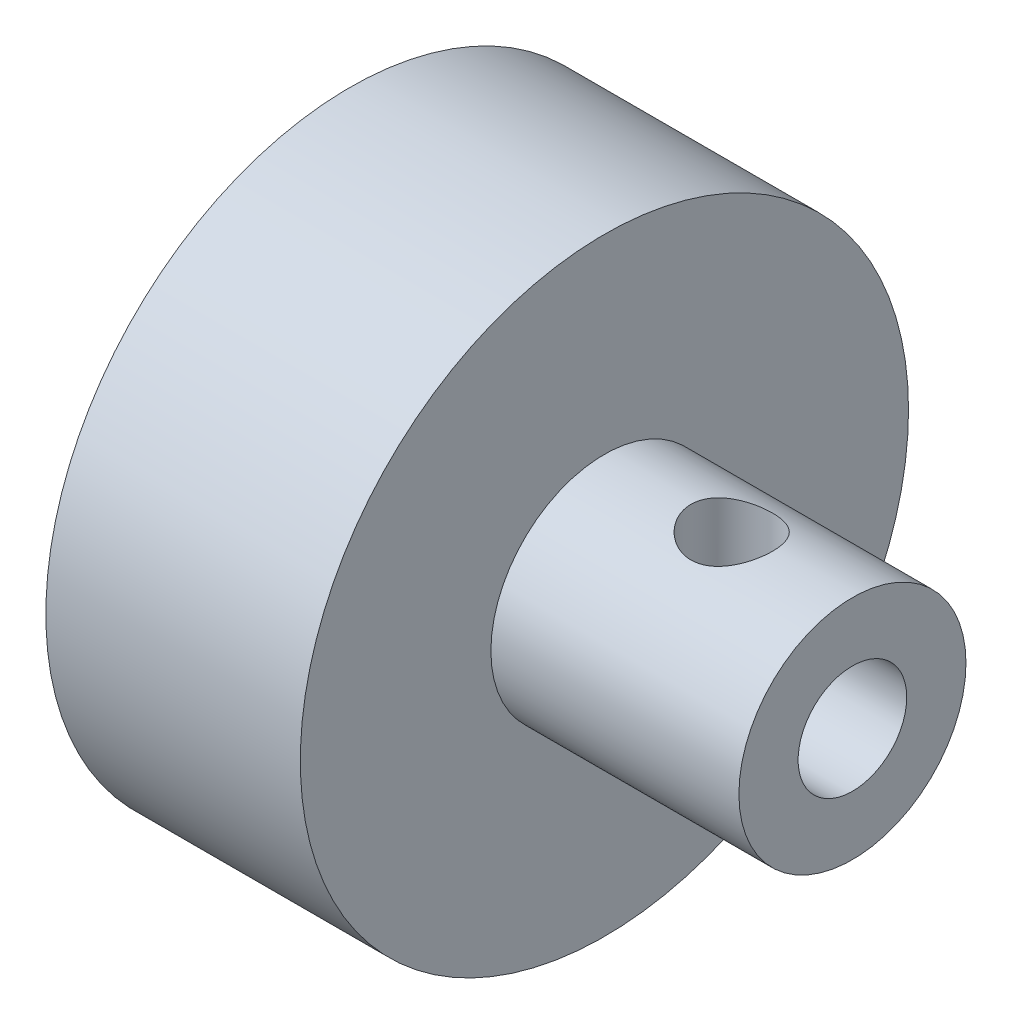
ISO-10303-21;
HEADER;
FILE_DESCRIPTION(('STEP AP214'),'2;1');
FILE_NAME('part.step','',(''),(''),'','','');
FILE_SCHEMA(('AUTOMOTIVE_DESIGN { 1 0 10303 214 1 1 1 1 }'));
ENDSEC;
DATA;
#1=APPLICATION_CONTEXT('core data for automotive mechanical design processes');
#2=APPLICATION_PROTOCOL_DEFINITION('international standard','automotive_design',2000,#1);
#3=PRODUCT_CONTEXT('',#1,'mechanical');
#4=PRODUCT('Part','Part','',(#3));
#5=PRODUCT_RELATED_PRODUCT_CATEGORY('part','',(#4));
#6=PRODUCT_DEFINITION_FORMATION('','',#4);
#7=PRODUCT_DEFINITION_CONTEXT('part definition',#1,'design');
#8=PRODUCT_DEFINITION('design','',#6,#7);
#9=PRODUCT_DEFINITION_SHAPE('','',#8);
#10=(LENGTH_UNIT() NAMED_UNIT(*) SI_UNIT(.MILLI.,.METRE.));
#11=(NAMED_UNIT(*) PLANE_ANGLE_UNIT() SI_UNIT($,.RADIAN.));
#12=(NAMED_UNIT(*) SI_UNIT($,.STERADIAN.) SOLID_ANGLE_UNIT());
#13=UNCERTAINTY_MEASURE_WITH_UNIT(LENGTH_MEASURE(1.E-05),#10,'distance_accuracy_value','');
#14=(GEOMETRIC_REPRESENTATION_CONTEXT(3) GLOBAL_UNCERTAINTY_ASSIGNED_CONTEXT((#13)) GLOBAL_UNIT_ASSIGNED_CONTEXT((#10,
#11,#12)) REPRESENTATION_CONTEXT('',''));
#15=CARTESIAN_POINT('',(0.,0.,0.));
#16=DIRECTION('',(0.,0.,1.));
#17=DIRECTION('',(1.,0.,0.));
#18=AXIS2_PLACEMENT_3D('',#15,#16,#17);
#19=CARTESIAN_POINT('',(-14.6892880689265,0.,0.));
#20=DIRECTION('',(1.,0.,0.));
#21=DIRECTION('',(0.,0.,-1.));
#22=AXIS2_PLACEMENT_3D('',#19,#20,#21);
#23=PLANE('',#22);
#24=CARTESIAN_POINT('',(-14.6892880689265,0.,0.));
#25=DIRECTION('',(1.,0.,0.));
#26=DIRECTION('',(0.,0.,-1.));
#27=AXIS2_PLACEMENT_3D('',#24,#25,#26);
#28=CIRCLE('',#27,8.89);
#29=CARTESIAN_POINT('',(-14.6892880689265,0.,-8.89));
#30=VERTEX_POINT('',#29);
#31=EDGE_CURVE('E122',#30,#30,#28,.T.);
#32=ORIENTED_EDGE('',*,*,#31,.F.);
#33=EDGE_LOOP('',(#32));
#34=FACE_BOUND('',#33,.T.);
#35=CARTESIAN_POINT('',(-14.6892880689265,0.,0.));
#36=DIRECTION('',(1.,0.,0.));
#37=DIRECTION('',(0.,0.,-1.));
#38=AXIS2_PLACEMENT_3D('',#35,#36,#37);
#39=CIRCLE('',#38,1.5875);
#40=CARTESIAN_POINT('',(-14.6892880689265,0.,-1.5875));
#41=VERTEX_POINT('',#40);
#42=EDGE_CURVE('E10',#41,#41,#39,.T.);
#43=ORIENTED_EDGE('',*,*,#42,.T.);
#44=EDGE_LOOP('',(#43));
#45=FACE_BOUND('',#44,.T.);
#46=ADVANCED_FACE('F45',(#34,#45),#23,.F.);
#47=CARTESIAN_POINT('',(0.,0.,0.));
#48=DIRECTION('',(1.,0.,0.));
#49=DIRECTION('',(0.,0.,-1.));
#50=AXIS2_PLACEMENT_3D('',#47,#48,#49);
#51=CYLINDRICAL_SURFACE('',#50,1.5875);
#52=CARTESIAN_POINT('',(-3.52955632665525,-1.05003255157876,1.190625));
#53=CARTESIAN_POINT('',(-3.47399587181116,-1.050045445975,1.19061880120499));
#54=CARTESIAN_POINT('',(-3.41839494567017,-1.05454741000987,1.18668886577821));
#55=CARTESIAN_POINT('',(-3.30942575328898,-1.07148823701036,1.17140301985762));
#56=CARTESIAN_POINT('',(-3.25606464842102,-1.08395075602632,1.16002497361435));
#57=CARTESIAN_POINT('',(-3.15365232330667,-1.11422757784016,1.13096547199778));
#58=CARTESIAN_POINT('',(-3.10455179760005,-1.13196567044321,1.11337314984434));
#59=CARTESIAN_POINT('',(-3.01016962218938,-1.17067373681068,1.0725995764387));
#60=CARTESIAN_POINT('',(-2.96488751182031,-1.19164331985289,1.04941900067592));
#61=CARTESIAN_POINT('',(-2.86906679457896,-1.2396574216291,0.992504284125244));
#62=CARTESIAN_POINT('',(-2.81941365386299,-1.26705442557768,0.957576618231006));
#63=CARTESIAN_POINT('',(-2.72586423782545,-1.321761740015,0.880535424277007));
#64=CARTESIAN_POINT('',(-2.68197661082916,-1.34907186163527,0.83841131436972));
#65=CARTESIAN_POINT('',(-2.59224970284748,-1.40702174808774,0.737878090100433));
#66=CARTESIAN_POINT('',(-2.54784159057137,-1.43720281226121,0.677900035756593));
#67=CARTESIAN_POINT('',(-2.47019994883075,-1.49131980240358,0.548631836139916));
#68=CARTESIAN_POINT('',(-2.43694016553939,-1.51527037067959,0.479364114482458));
#69=CARTESIAN_POINT('',(-2.39194772596979,-1.54808443073509,0.355496037787019));
#70=CARTESIAN_POINT('',(-2.37674788172235,-1.55931958043549,0.302772801943451));
#71=CARTESIAN_POINT('',(-2.35370292208284,-1.57643223525434,0.194907383645006));
#72=CARTESIAN_POINT('',(-2.34585141687053,-1.58231439499439,0.139767346508667));
#73=CARTESIAN_POINT('',(-2.3379615754019,-1.58822529365106,0.0284679172687354));
#74=CARTESIAN_POINT('',(-2.33794354099396,-1.58823882295637,-0.0276937463004187));
#75=CARTESIAN_POINT('',(-2.34577181397461,-1.58237401411808,-0.139157199360015));
#76=CARTESIAN_POINT('',(-2.35361994258859,-1.57649431153499,-0.194458786708892));
#77=CARTESIAN_POINT('',(-2.37630191056096,-1.55965031243376,-0.300743297572916));
#78=CARTESIAN_POINT('',(-2.390887285725,-1.54886705851508,-0.351809262912558));
#79=CARTESIAN_POINT('',(-2.4262403676374,-1.52306558684007,-0.450596385005576));
#80=CARTESIAN_POINT('',(-2.44700942243758,-1.50804644569141,-0.498316809620447));
#81=CARTESIAN_POINT('',(-2.49651420867685,-1.472890802502,-0.594690931730129));
#82=CARTESIAN_POINT('',(-2.52586905334639,-1.45237629107677,-0.642886211616418));
#83=CARTESIAN_POINT('',(-2.59033870418185,-1.40859432596468,-0.733875255122699));
#84=CARTESIAN_POINT('',(-2.62545841877955,-1.38532453106985,-0.776664360293093));
#85=CARTESIAN_POINT('',(-2.70820235978188,-1.33265676661185,-0.864458871498921));
#86=CARTESIAN_POINT('',(-2.75692738711371,-1.30295376843929,-0.908244413225473));
#87=CARTESIAN_POINT('',(-2.86108752740517,-1.24401229387742,-0.987431949727556));
#88=CARTESIAN_POINT('',(-2.91652581815327,-1.21477404494797,-1.0228299505536));
#89=CARTESIAN_POINT('',(-3.02233568616272,-1.16537919386833,-1.07849357589208));
#90=CARTESIAN_POINT('',(-3.07155229386264,-1.14456844833299,-1.10036663076556));
#91=CARTESIAN_POINT('',(-3.17400814378189,-1.10757288373056,-1.13759771455097));
#92=CARTESIAN_POINT('',(-3.22723796990948,-1.09137763785656,-1.15297046685305));
#93=CARTESIAN_POINT('',(-3.32610783845392,-1.06870540179809,-1.17397518372094));
#94=CARTESIAN_POINT('',(-3.37116119808551,-1.06093847023265,-1.18093386412912));
#95=CARTESIAN_POINT('',(-3.46236972793073,-1.05120748322927,-1.18960709991958));
#96=CARTESIAN_POINT('',(-3.50852341207812,-1.04923600365031,-1.19132836468154));
#97=CARTESIAN_POINT('',(-3.60058027634364,-1.05142402102457,-1.18939683154219));
#98=CARTESIAN_POINT('',(-3.64648335801668,-1.05558577464436,-1.1857420555772));
#99=CARTESIAN_POINT('',(-3.73678552265678,-1.06934967402693,-1.17334131022126));
#100=CARTESIAN_POINT('',(-3.78118190127656,-1.0789611050858,-1.16458665082263));
#101=CARTESIAN_POINT('',(-3.88383714982548,-1.10670783140942,-1.13834830402645));
#102=CARTESIAN_POINT('',(-3.94106486507531,-1.12668703809744,-1.11882388129336));
#103=CARTESIAN_POINT('',(-4.05050053466959,-1.1710817723223,-1.07226796784258));
#104=CARTESIAN_POINT('',(-4.10269900600796,-1.19550543916301,-1.04522265503785));
#105=CARTESIAN_POINT('',(-4.20372710179345,-1.24704699135672,-0.983216332051275));
#106=CARTESIAN_POINT('',(-4.25237117215349,-1.27422976552798,-0.948008248603961));
#107=CARTESIAN_POINT('',(-4.34394549064199,-1.32832083103686,-0.870605343134578));
#108=CARTESIAN_POINT('',(-4.38687294449647,-1.3552289822489,-0.828407126793555));
#109=CARTESIAN_POINT('',(-4.47513243876106,-1.41255926707429,-0.727261145352264));
#110=CARTESIAN_POINT('',(-4.51894604749847,-1.44246738243752,-0.666667665064069));
#111=CARTESIAN_POINT('',(-4.59526153383188,-1.49584651911049,-0.536219092541945));
#112=CARTESIAN_POINT('',(-4.62778789366665,-1.519331448665,-0.46638450504254));
#113=CARTESIAN_POINT('',(-4.6713164823662,-1.55114153831888,-0.341912306313174));
#114=CARTESIAN_POINT('',(-4.68585703131764,-1.56190535686026,-0.289123483003683));
#115=CARTESIAN_POINT('',(-4.70758355872435,-1.57805648311366,-0.181264294065456));
#116=CARTESIAN_POINT('',(-4.71477611263438,-1.58344859766149,-0.126196014246044));
#117=CARTESIAN_POINT('',(-4.72138496195483,-1.58840143581668,-0.0151984122151932));
#118=CARTESIAN_POINT('',(-4.72078300292542,-1.58794847048757,0.040732624740999));
#119=CARTESIAN_POINT('',(-4.7117985398099,-1.58121987574774,0.151613402505125));
#120=CARTESIAN_POINT('',(-4.70341396297494,-1.57494269517078,0.206562877919334));
#121=CARTESIAN_POINT('',(-4.67971998694751,-1.55736449484373,0.312358036108632));
#122=CARTESIAN_POINT('',(-4.66461868273127,-1.54621460816847,0.363276543980955));
#123=CARTESIAN_POINT('',(-4.62827454957022,-1.51973534456514,0.461693691083551));
#124=CARTESIAN_POINT('',(-4.60703040691447,-1.50440507365769,0.50919159606487));
#125=CARTESIAN_POINT('',(-4.55644821368846,-1.46857753504696,0.605272235896156));
#126=CARTESIAN_POINT('',(-4.52646589988858,-1.44769167461642,0.653368356641274));
#127=CARTESIAN_POINT('',(-4.46073108946535,-1.403234954476,0.744073006806094));
#128=CARTESIAN_POINT('',(-4.42497328955946,-1.37966163294053,0.786676427329301));
#129=CARTESIAN_POINT('',(-4.34076456694763,-1.32640667727172,0.874017021494155));
#130=CARTESIAN_POINT('',(-4.29120199709983,-1.29643919738103,0.917509051614588));
#131=CARTESIAN_POINT('',(-4.18529854458473,-1.2371870295527,0.995959824095465));
#132=CARTESIAN_POINT('',(-4.12895518973873,-1.20790259531751,1.03091544004403));
#133=CARTESIAN_POINT('',(-4.0225677464992,-1.15926871150369,1.0850242722053));
#134=CARTESIAN_POINT('',(-3.97379043413193,-1.13913939849811,1.10595986530786));
#135=CARTESIAN_POINT('',(-3.87239051441715,-1.10357098191916,1.14145534685201));
#136=CARTESIAN_POINT('',(-3.81977855895137,-1.08811945745383,1.15603216594685));
#137=CARTESIAN_POINT('',(-3.72736817735019,-1.06785111060464,1.17472664594127));
#138=CARTESIAN_POINT('',(-3.68833246381845,-1.06124478398383,1.18065747665075));
#139=CARTESIAN_POINT('',(-3.60938984980979,-1.05233228217761,1.18860759763756));
#140=CARTESIAN_POINT('',(-3.56948353840617,-1.05002328532471,1.19062945461798));
#141=CARTESIAN_POINT('',(-3.52955632665525,-1.05003255157876,1.190625));
#142=B_SPLINE_CURVE_WITH_KNOTS('',3,(#52,#53,#54,#55,#56,#57,#58,#59,#60,#61,#62,#63,#64,#65,
#66,#67,#68,#69,#70,#71,#72,#73,#74,#75,#76,#77,#78,#79,#80,#81,#82,#83,#84,#85,#86,#87,#88,#89,
#90,#91,#92,#93,#94,#95,#96,#97,#98,#99,#100,#101,#102,#103,#104,#105,#106,#107,#108,#109,#110,
#111,#112,#113,#114,#115,#116,#117,#118,#119,#120,#121,#122,#123,#124,#125,#126,#127,#128,#129,
#130,#131,#132,#133,#134,#135,#136,#137,#138,#139,#140,#141),.UNSPECIFIED.,.T.,.F.,(4,2,2,2,2,2,
2,2,2,2,2,2,2,2,2,2,2,2,2,2,2,2,2,2,2,2,2,2,2,2,2,2,2,2,2,2,2,2,2,2,2,2,2,2,4),(0.,
0.166474597743314,0.333446217300251,0.498114149835984,0.662762187833673,0.861895093986152,
1.0613233713153,1.30147098182183,1.54104901534439,1.70837006939059,1.87554549222377,
2.04315417765196,2.21080167790273,2.37270731241696,2.53464826848756,2.71412370017785,
2.89375274442082,3.10871804281232,3.32378549783047,3.49646406272525,3.66874938249073,
3.80688854402059,3.9448506680219,4.08286356658931,4.22111232464965,4.41110709885653,
4.60145338469826,4.79856172215235,4.99576605498253,5.23599171487223,5.47569301565586,
5.64239486354326,5.80894740496725,5.97589007623953,6.14287722220568,6.30501670074205,
6.46719088019845,6.64773604163628,6.82844793934811,7.0449089208391,7.26144906140521,
7.43123259464913,7.6005612670708,7.72027294583552,7.83990599300725),.UNSPECIFIED.);
#143=CARTESIAN_POINT('',(-3.52955632665525,-1.05003255157876,1.190625));
#144=VERTEX_POINT('',#143);
#145=EDGE_CURVE('E95',#144,#144,#142,.T.);
#146=ORIENTED_EDGE('',*,*,#145,.F.);
#147=EDGE_LOOP('',(#146));
#148=FACE_BOUND('',#147,.T.);
#149=CARTESIAN_POINT('',(-3.52955632665525,1.05003255157876,1.190625));
#150=CARTESIAN_POINT('',(-3.58511678149935,1.050045445975,1.19061880120499));
#151=CARTESIAN_POINT('',(-3.64071770764034,1.05454741000987,1.18668886577821));
#152=CARTESIAN_POINT('',(-3.74968690002153,1.07148823701036,1.17140301985762));
#153=CARTESIAN_POINT('',(-3.80304800488949,1.08395075602632,1.16002497361435));
#154=CARTESIAN_POINT('',(-3.90546033000384,1.11422757784016,1.13096547199778));
#155=CARTESIAN_POINT('',(-3.95456085571046,1.13196567044321,1.11337314984434));
#156=CARTESIAN_POINT('',(-4.04894303112113,1.17067373681068,1.0725995764387));
#157=CARTESIAN_POINT('',(-4.0942251414902,1.19164331985289,1.04941900067592));
#158=CARTESIAN_POINT('',(-4.19004585873155,1.2396574216291,0.992504284125244));
#159=CARTESIAN_POINT('',(-4.23969899944752,1.26705442557768,0.957576618231007));
#160=CARTESIAN_POINT('',(-4.33324841548505,1.321761740015,0.880535424277007));
#161=CARTESIAN_POINT('',(-4.37713604248134,1.34907186163527,0.83841131436972));
#162=CARTESIAN_POINT('',(-4.46686295046303,1.40702174808774,0.737878090100434));
#163=CARTESIAN_POINT('',(-4.51127106273914,1.43720281226121,0.677900035756593));
#164=CARTESIAN_POINT('',(-4.58891270447975,1.49131980240358,0.548631836139916));
#165=CARTESIAN_POINT('',(-4.62217248777112,1.51527037067959,0.479364114482458));
#166=CARTESIAN_POINT('',(-4.66716492734071,1.54808443073509,0.355496037787019));
#167=CARTESIAN_POINT('',(-4.68236477158816,1.55931958043549,0.302772801943451));
#168=CARTESIAN_POINT('',(-4.70540973122767,1.57643223525434,0.194907383645006));
#169=CARTESIAN_POINT('',(-4.71326123643998,1.58231439499439,0.139767346508666));
#170=CARTESIAN_POINT('',(-4.72115107790861,1.58822529365106,0.0284679172687352));
#171=CARTESIAN_POINT('',(-4.72116911231655,1.58823882295637,-0.0276937463004189));
#172=CARTESIAN_POINT('',(-4.7133408393359,1.58237401411808,-0.139157199360016));
#173=CARTESIAN_POINT('',(-4.70549271072191,1.57649431153499,-0.194458786708892));
#174=CARTESIAN_POINT('',(-4.68281074274955,1.55965031243376,-0.300743297572916));
#175=CARTESIAN_POINT('',(-4.66822536758551,1.54886705851508,-0.351809262912558));
#176=CARTESIAN_POINT('',(-4.63287228567311,1.52306558684007,-0.450596385005576));
#177=CARTESIAN_POINT('',(-4.61210323087293,1.50804644569141,-0.498316809620447));
#178=CARTESIAN_POINT('',(-4.56259844463366,1.472890802502,-0.594690931730128));
#179=CARTESIAN_POINT('',(-4.53324359996412,1.45237629107677,-0.642886211616417));
#180=CARTESIAN_POINT('',(-4.46877394912866,1.40859432596468,-0.733875255122699));
#181=CARTESIAN_POINT('',(-4.43365423453096,1.38532453106985,-0.776664360293093));
#182=CARTESIAN_POINT('',(-4.35091029352863,1.33265676661185,-0.86445887149892));
#183=CARTESIAN_POINT('',(-4.3021852661968,1.30295376843929,-0.908244413225473));
#184=CARTESIAN_POINT('',(-4.19802512590534,1.24401229387742,-0.987431949727557));
#185=CARTESIAN_POINT('',(-4.14258683515724,1.21477404494797,-1.0228299505536));
#186=CARTESIAN_POINT('',(-4.03677696714779,1.16537919386833,-1.07849357589208));
#187=CARTESIAN_POINT('',(-3.98756035944787,1.14456844833299,-1.10036663076556));
#188=CARTESIAN_POINT('',(-3.88510450952862,1.10757288373056,-1.13759771455097));
#189=CARTESIAN_POINT('',(-3.83187468340103,1.09137763785656,-1.15297046685305));
#190=CARTESIAN_POINT('',(-3.73300481485659,1.06870540179809,-1.17397518372094));
#191=CARTESIAN_POINT('',(-3.687951455225,1.06093847023265,-1.18093386412912));
#192=CARTESIAN_POINT('',(-3.59674292537978,1.05120748322927,-1.18960709991958));
#193=CARTESIAN_POINT('',(-3.55058924123239,1.04923600365031,-1.19132836468154));
#194=CARTESIAN_POINT('',(-3.45853237696687,1.05142402102457,-1.18939683154219));
#195=CARTESIAN_POINT('',(-3.41262929529383,1.05558577464436,-1.1857420555772));
#196=CARTESIAN_POINT('',(-3.32232713065373,1.06934967402693,-1.17334131022126));
#197=CARTESIAN_POINT('',(-3.27793075203395,1.0789611050858,-1.16458665082263));
#198=CARTESIAN_POINT('',(-3.17527550348503,1.10670783140942,-1.13834830402645));
#199=CARTESIAN_POINT('',(-3.1180477882352,1.12668703809744,-1.11882388129336));
#200=CARTESIAN_POINT('',(-3.00861211864092,1.1710817723223,-1.07226796784258));
#201=CARTESIAN_POINT('',(-2.95641364730255,1.19550543916301,-1.04522265503785));
#202=CARTESIAN_POINT('',(-2.85538555151706,1.24704699135672,-0.983216332051275));
#203=CARTESIAN_POINT('',(-2.80674148115702,1.27422976552798,-0.948008248603961));
#204=CARTESIAN_POINT('',(-2.71516716266852,1.32832083103686,-0.870605343134578));
#205=CARTESIAN_POINT('',(-2.67223970881404,1.3552289822489,-0.828407126793555));
#206=CARTESIAN_POINT('',(-2.58398021454945,1.41255926707429,-0.727261145352264));
#207=CARTESIAN_POINT('',(-2.54016660581204,1.44246738243751,-0.66666766506407));
#208=CARTESIAN_POINT('',(-2.46385111947863,1.49584651911049,-0.536219092541946));
#209=CARTESIAN_POINT('',(-2.43132475964385,1.519331448665,-0.466384505042541));
#210=CARTESIAN_POINT('',(-2.3877961709443,1.55114153831888,-0.341912306313175));
#211=CARTESIAN_POINT('',(-2.37325562199287,1.56190535686026,-0.289123483003684));
#212=CARTESIAN_POINT('',(-2.35152909458616,1.57805648311366,-0.181264294065457));
#213=CARTESIAN_POINT('',(-2.34433654067613,1.58344859766149,-0.126196014246045));
#214=CARTESIAN_POINT('',(-2.33772769135568,1.58840143581668,-0.0151984122151944));
#215=CARTESIAN_POINT('',(-2.33832965038508,1.58794847048757,0.0407326247409978));
#216=CARTESIAN_POINT('',(-2.34731411350061,1.58121987574774,0.151613402505124));
#217=CARTESIAN_POINT('',(-2.35569869033556,1.57494269517078,0.206562877919333));
#218=CARTESIAN_POINT('',(-2.379392666363,1.55736449484374,0.312358036108631));
#219=CARTESIAN_POINT('',(-2.39449397057923,1.54621460816847,0.363276543980954));
#220=CARTESIAN_POINT('',(-2.43083810374029,1.51973534456514,0.46169369108355));
#221=CARTESIAN_POINT('',(-2.45208224639604,1.50440507365769,0.509191596064869));
#222=CARTESIAN_POINT('',(-2.50266443962205,1.46857753504696,0.605272235896155));
#223=CARTESIAN_POINT('',(-2.53264675342192,1.44769167461642,0.653368356641273));
#224=CARTESIAN_POINT('',(-2.59838156384516,1.403234954476,0.744073006806093));
#225=CARTESIAN_POINT('',(-2.63413936375105,1.37966163294053,0.7866764273293));
#226=CARTESIAN_POINT('',(-2.71834808636288,1.32640667727172,0.874017021494154));
#227=CARTESIAN_POINT('',(-2.76791065621068,1.29643919738103,0.917509051614587));
#228=CARTESIAN_POINT('',(-2.87381410872578,1.2371870295527,0.995959824095464));
#229=CARTESIAN_POINT('',(-2.93015746357177,1.20790259531751,1.03091544004403));
#230=CARTESIAN_POINT('',(-3.03654490681131,1.15926871150369,1.0850242722053));
#231=CARTESIAN_POINT('',(-3.08532221917858,1.13913939849812,1.10595986530786));
#232=CARTESIAN_POINT('',(-3.18672213889336,1.10357098191916,1.14145534685201));
#233=CARTESIAN_POINT('',(-3.23933409435914,1.08811945745383,1.15603216594685));
#234=CARTESIAN_POINT('',(-3.33174447596032,1.06785111060464,1.17472664594127));
#235=CARTESIAN_POINT('',(-3.37078018949206,1.06124478398383,1.18065747665075));
#236=CARTESIAN_POINT('',(-3.44972280350072,1.05233228217761,1.18860759763756));
#237=CARTESIAN_POINT('',(-3.48962911490434,1.05002328532471,1.19062945461798));
#238=CARTESIAN_POINT('',(-3.52955632665525,1.05003255157876,1.190625));
#239=B_SPLINE_CURVE_WITH_KNOTS('',3,(#149,#150,#151,#152,#153,#154,#155,#156,#157,#158,#159,
#160,#161,#162,#163,#164,#165,#166,#167,#168,#169,#170,#171,#172,#173,#174,#175,#176,#177,#178,
#179,#180,#181,#182,#183,#184,#185,#186,#187,#188,#189,#190,#191,#192,#193,#194,#195,#196,#197,
#198,#199,#200,#201,#202,#203,#204,#205,#206,#207,#208,#209,#210,#211,#212,#213,#214,#215,#216,
#217,#218,#219,#220,#221,#222,#223,#224,#225,#226,#227,#228,#229,#230,#231,#232,#233,#234,#235,
#236,#237,#238),.UNSPECIFIED.,.T.,.F.,(4,2,2,2,2,2,2,2,2,2,2,2,2,2,2,2,2,2,2,2,2,2,2,2,2,2,2,2,
2,2,2,2,2,2,2,2,2,2,2,2,2,2,2,2,4),(0.,0.166474597743314,0.333446217300251,0.498114149835984,
0.662762187833672,0.861895093986151,1.0613233713153,1.30147098182183,1.5410490153444,
1.70837006939059,1.87554549222377,2.04315417765196,2.21080167790273,2.37270731241696,
2.53464826848756,2.71412370017785,2.89375274442082,3.10871804281232,3.32378549783047,
3.49646406272525,3.66874938249073,3.80688854402059,3.9448506680219,4.08286356658931,
4.22111232464965,4.41110709885653,4.60145338469826,4.79856172215235,4.99576605498252,
5.23599171487223,5.47569301565586,5.64239486354326,5.80894740496724,5.97589007623953,
6.14287722220568,6.30501670074205,6.46719088019845,6.64773604163628,6.82844793934811,
7.0449089208391,7.26144906140521,7.43123259464912,7.60056126707079,7.72027294583552,
7.83990599300725),.UNSPECIFIED.);
#240=CARTESIAN_POINT('',(-3.52955632665525,1.05003255157876,1.190625));
#241=VERTEX_POINT('',#240);
#242=EDGE_CURVE('E89',#241,#241,#239,.T.);
#243=ORIENTED_EDGE('',*,*,#242,.F.);
#244=EDGE_LOOP('',(#243));
#245=FACE_BOUND('',#244,.T.);
#246=CARTESIAN_POINT('',(0.,0.,0.));
#247=DIRECTION('',(1.,0.,0.));
#248=DIRECTION('',(0.,0.,-1.));
#249=AXIS2_PLACEMENT_3D('',#246,#247,#248);
#250=CIRCLE('',#249,1.5875);
#251=CARTESIAN_POINT('',(0.,0.,-1.5875));
#252=VERTEX_POINT('',#251);
#253=EDGE_CURVE('E58',#252,#252,#250,.T.);
#254=ORIENTED_EDGE('',*,*,#253,.T.);
#255=EDGE_LOOP('',(#254));
#256=FACE_BOUND('',#255,.T.);
#257=ORIENTED_EDGE('',*,*,#42,.F.);
#258=EDGE_LOOP('',(#257));
#259=FACE_BOUND('',#258,.T.);
#260=ADVANCED_FACE('F100',(#148,#245,#256,#259),#51,.F.);
#261=CARTESIAN_POINT('',(0.,0.,0.));
#262=DIRECTION('',(1.,0.,0.));
#263=DIRECTION('',(0.,0.,-1.));
#264=AXIS2_PLACEMENT_3D('',#261,#262,#263);
#265=PLANE('',#264);
#266=CARTESIAN_POINT('',(0.,0.,0.));
#267=DIRECTION('',(1.,0.,0.));
#268=DIRECTION('',(0.,0.,-1.));
#269=AXIS2_PLACEMENT_3D('',#266,#267,#268);
#270=CIRCLE('',#269,3.319160609);
#271=CARTESIAN_POINT('',(0.,0.,-3.319160609));
#272=VERTEX_POINT('',#271);
#273=EDGE_CURVE('E64',#272,#272,#270,.T.);
#274=ORIENTED_EDGE('',*,*,#273,.T.);
#275=EDGE_LOOP('',(#274));
#276=FACE_BOUND('',#275,.T.);
#277=ORIENTED_EDGE('',*,*,#253,.F.);
#278=EDGE_LOOP('',(#277));
#279=FACE_BOUND('',#278,.T.);
#280=ADVANCED_FACE('F103',(#276,#279),#265,.T.);
#281=CARTESIAN_POINT('',(0.,0.,0.));
#282=DIRECTION('',(1.,0.,0.));
#283=DIRECTION('',(0.,0.,-1.));
#284=AXIS2_PLACEMENT_3D('',#281,#282,#283);
#285=CYLINDRICAL_SURFACE('',#284,3.319160609);
#286=CARTESIAN_POINT('',(-3.52955632665525,-3.09826391027495,1.190625));
#287=CARTESIAN_POINT('',(-3.59408007466283,-3.09826260773656,1.19062647809619));
#288=CARTESIAN_POINT('',(-3.65859363682063,-3.10030150172999,1.18536230345289));
#289=CARTESIAN_POINT('',(-3.78568914708763,-3.10818567970155,1.16453036070752));
#290=CARTESIAN_POINT('',(-3.84827101372972,-3.11403112398758,1.14896215866428));
#291=CARTESIAN_POINT('',(-3.96963662196236,-3.12878289468804,1.10815585906638));
#292=CARTESIAN_POINT('',(-4.02842844511328,-3.13768243382309,1.08293918965556));
#293=CARTESIAN_POINT('',(-4.14096875389151,-3.15752914333163,1.02362668670721));
#294=CARTESIAN_POINT('',(-4.19471586735844,-3.16847686840162,0.989528446849791));
#295=CARTESIAN_POINT('',(-4.2980813925835,-3.19174357981551,0.911762384501221));
#296=CARTESIAN_POINT('',(-4.34743793649846,-3.20410050817652,0.8677577543124));
#297=CARTESIAN_POINT('',(-4.43825303036555,-3.22847515809689,0.772144343385981));
#298=CARTESIAN_POINT('',(-4.47971007320197,-3.24049281455604,0.720534114929426));
#299=CARTESIAN_POINT('',(-4.55478089773731,-3.2632811034021,0.609216259069055));
#300=CARTESIAN_POINT('',(-4.58811418228087,-3.27400200406076,0.549308382092975));
#301=CARTESIAN_POINT('',(-4.64412295741338,-3.29253643469306,0.424283694540155));
#302=CARTESIAN_POINT('',(-4.66680180777382,-3.30035088102647,0.359168533619218));
#303=CARTESIAN_POINT('',(-4.69995187595677,-3.31192284302522,0.228327807881751));
#304=CARTESIAN_POINT('',(-4.71087302213077,-3.31582944243157,0.162729675912374));
#305=CARTESIAN_POINT('',(-4.72163485025988,-3.31967821697181,0.0305232627999932));
#306=CARTESIAN_POINT('',(-4.72147883108634,-3.31962157239258,-0.0360847116956704));
#307=CARTESIAN_POINT('',(-4.7103622451407,-3.31564759148526,-0.165211502659484));
#308=CARTESIAN_POINT('',(-4.69989176663472,-3.31190537582672,-0.227778814446603));
#309=CARTESIAN_POINT('',(-4.66926222925901,-3.30120645112964,-0.350200906843375));
#310=CARTESIAN_POINT('',(-4.64910249286739,-3.29424951730307,-0.410055497445522));
#311=CARTESIAN_POINT('',(-4.59941607557278,-3.27769503816409,-0.526349393450865));
#312=CARTESIAN_POINT('',(-4.56976155477704,-3.26806170614586,-0.582728774715911));
#313=CARTESIAN_POINT('',(-4.50203709220196,-3.2471406653287,-0.689846038442101));
#314=CARTESIAN_POINT('',(-4.46396457213081,-3.2358524500245,-0.740582185303806));
#315=CARTESIAN_POINT('',(-4.37807889587561,-3.21207705382902,-0.837873015116891));
#316=CARTESIAN_POINT('',(-4.32985099685481,-3.19955804442011,-0.884054350484591));
#317=CARTESIAN_POINT('',(-4.22624619004998,-3.17522977372587,-0.967806570064743));
#318=CARTESIAN_POINT('',(-4.17086779153653,-3.16342066119367,-1.00537565425754));
#319=CARTESIAN_POINT('',(-4.05317947356705,-3.14165894087,-1.07146820132114));
#320=CARTESIAN_POINT('',(-3.99075886704427,-3.13174538423792,-1.09980844148453));
#321=CARTESIAN_POINT('',(-3.86158325809118,-3.11534754218169,-1.14543955660008));
#322=CARTESIAN_POINT('',(-3.79483044128047,-3.10886154240999,-1.1627359562095));
#323=CARTESIAN_POINT('',(-3.66254754214888,-3.10045083626059,-1.1849754110495));
#324=CARTESIAN_POINT('',(-3.59713007982367,-3.09830943089934,-1.19050605978971));
#325=CARTESIAN_POINT('',(-3.46628094431449,-3.09821988036728,-1.19074006093205));
#326=CARTESIAN_POINT('',(-3.40084927744975,-3.10027081018681,-1.18544580177492));
#327=CARTESIAN_POINT('',(-3.27470065851702,-3.10811632846454,-1.16471130314723));
#328=CARTESIAN_POINT('',(-3.21390107968744,-3.11375021722895,-1.1497061233527));
#329=CARTESIAN_POINT('',(-3.09570369547788,-3.12794178839865,-1.1105127828248));
#330=CARTESIAN_POINT('',(-3.03830655300375,-3.13650003838236,-1.08632283935332));
#331=CARTESIAN_POINT('',(-2.9262931791618,-3.15594873689513,-1.02848161086374));
#332=CARTESIAN_POINT('',(-2.87184665607727,-3.16691085276989,-0.994526460511018));
#333=CARTESIAN_POINT('',(-2.7692139180868,-3.18980439385494,-0.918450242189271));
#334=CARTESIAN_POINT('',(-2.72102982998052,-3.20173614614136,-0.876326412077));
#335=CARTESIAN_POINT('',(-2.62943959145032,-3.22604826285295,-0.782258212069733));
#336=CARTESIAN_POINT('',(-2.58646338517795,-3.2384153384906,-0.729890418601334));
#337=CARTESIAN_POINT('',(-2.50986671777136,-3.26154407453933,-0.618381149950051));
#338=CARTESIAN_POINT('',(-2.47624611466814,-3.27230575931067,-0.559239777573798));
#339=CARTESIAN_POINT('',(-2.41957990162255,-3.290983516001,-0.436020301253414));
#340=CARTESIAN_POINT('',(-2.39648224265255,-3.29891355084018,-0.371968367371977));
#341=CARTESIAN_POINT('',(-2.36150419717112,-3.3110893905642,-0.240542625186322));
#342=CARTESIAN_POINT('',(-2.34961904022087,-3.31533676220201,-0.173170242440207));
#343=CARTESIAN_POINT('',(-2.33788439924828,-3.31953226581909,-0.0409198343073707));
#344=CARTESIAN_POINT('',(-2.33742175424627,-3.3196994183637,0.0238973633318537));
#345=CARTESIAN_POINT('',(-2.34699413954799,-3.31627388859086,0.152644028576295));
#346=CARTESIAN_POINT('',(-2.35702807981761,-3.31268159667873,0.216573587661201));
#347=CARTESIAN_POINT('',(-2.38688610324784,-3.30223342848542,0.340390767382702));
#348=CARTESIAN_POINT('',(-2.40650245140749,-3.29544690832865,0.400334769170669));
#349=CARTESIAN_POINT('',(-2.45476797518258,-3.27931297210783,0.516093683981795));
#350=CARTESIAN_POINT('',(-2.48341884579022,-3.26996507553991,0.57190781976116));
#351=CARTESIAN_POINT('',(-2.55025824382317,-3.24918707981549,0.68027773764795));
#352=CARTESIAN_POINT('',(-2.58878414295034,-3.2376883350824,0.732612058791284));
#353=CARTESIAN_POINT('',(-2.67373178178641,-3.21403367050118,0.830267258105566));
#354=CARTESIAN_POINT('',(-2.72015623130473,-3.20187752609409,0.875585719072224));
#355=CARTESIAN_POINT('',(-2.82219542786239,-3.1775829646916,0.960114914840125));
#356=CARTESIAN_POINT('',(-2.8781406096135,-3.16547248550747,0.998936232177532));
#357=CARTESIAN_POINT('',(-2.99614459468443,-3.143312905839,1.06662313000904));
#358=CARTESIAN_POINT('',(-3.05820307148864,-3.13326369534904,1.09548924184778));
#359=CARTESIAN_POINT('',(-3.18725929065792,-3.11645499711561,1.14243948488866));
#360=CARTESIAN_POINT('',(-3.25429071656027,-3.10972085906659,1.16044076404269));
#361=CARTESIAN_POINT('',(-3.39073829541402,-3.10062714092051,1.18452966346252));
#362=CARTESIAN_POINT('',(-3.46015320335198,-3.09826531131311,1.19062341012813));
#363=CARTESIAN_POINT('',(-3.52955632665525,-3.09826391027495,1.190625));
#364=B_SPLINE_CURVE_WITH_KNOTS('',3,(#286,#287,#288,#289,#290,#291,#292,#293,#294,#295,#296,
#297,#298,#299,#300,#301,#302,#303,#304,#305,#306,#307,#308,#309,#310,#311,#312,#313,#314,#315,
#316,#317,#318,#319,#320,#321,#322,#323,#324,#325,#326,#327,#328,#329,#330,#331,#332,#333,#334,
#335,#336,#337,#338,#339,#340,#341,#342,#343,#344,#345,#346,#347,#348,#349,#350,#351,#352,#353,
#354,#355,#356,#357,#358,#359,#360,#361,#362,#363),.UNSPECIFIED.,.T.,.F.,(4,2,2,2,2,2,2,2,2,2,2,
2,2,2,2,2,2,2,2,2,2,2,2,2,2,2,2,2,2,2,2,2,2,2,2,2,2,2,4),(0.,0.193313375866017,
0.386634893400087,0.579529534880816,0.772476492548964,0.973384874066122,1.17433154783321,
1.38145958715755,1.58852226676836,1.78734407501581,1.98610667273453,2.17585940720625,
2.36562541207924,2.55806224204852,2.75055809403564,2.95344078868977,3.15636584863736,
3.36310369946322,3.56973804893405,3.76578405416127,3.96178680786729,4.14956504451671,
4.33737974706778,4.53182486150919,4.72633584029463,4.93195385056457,5.13756874046125,
5.34215526317434,5.54665470378798,5.74015126367199,5.93362773160149,6.12308445812055,
6.3125767503187,6.50969341401667,6.70687784074065,6.9133726094506,7.11985635509587,
7.32789542036362,7.53582742176915),.UNSPECIFIED.);
#365=CARTESIAN_POINT('',(-3.52955632665525,-3.09826391027495,1.190625));
#366=VERTEX_POINT('',#365);
#367=EDGE_CURVE('E48',#366,#366,#364,.T.);
#368=ORIENTED_EDGE('',*,*,#367,.F.);
#369=EDGE_LOOP('',(#368));
#370=FACE_BOUND('',#369,.T.);
#371=CARTESIAN_POINT('',(-3.52955632665525,3.09826391027495,1.190625));
#372=CARTESIAN_POINT('',(-3.46503257864768,3.09826260773656,1.19062647809619));
#373=CARTESIAN_POINT('',(-3.40051901648988,3.10030150172999,1.18536230345289));
#374=CARTESIAN_POINT('',(-3.27342350622288,3.10818567970155,1.16453036070752));
#375=CARTESIAN_POINT('',(-3.21084163958079,3.11403112398758,1.14896215866428));
#376=CARTESIAN_POINT('',(-3.08947603134814,3.12878289468804,1.10815585906638));
#377=CARTESIAN_POINT('',(-3.03068420819723,3.13768243382309,1.08293918965555));
#378=CARTESIAN_POINT('',(-2.91814389941899,3.15752914333163,1.02362668670721));
#379=CARTESIAN_POINT('',(-2.86439678595207,3.16847686840162,0.98952844684979));
#380=CARTESIAN_POINT('',(-2.76103126072701,3.19174357981551,0.91176238450122));
#381=CARTESIAN_POINT('',(-2.71167471681205,3.20410050817652,0.867757754312399));
#382=CARTESIAN_POINT('',(-2.62085962294496,3.22847515809689,0.77214434338598));
#383=CARTESIAN_POINT('',(-2.57940258010854,3.24049281455604,0.720534114929425));
#384=CARTESIAN_POINT('',(-2.5043317555732,3.2632811034021,0.609216259069054));
#385=CARTESIAN_POINT('',(-2.47099847102964,3.27400200406076,0.549308382092974));
#386=CARTESIAN_POINT('',(-2.41498969589713,3.29253643469306,0.424283694540153));
#387=CARTESIAN_POINT('',(-2.39231084553669,3.30035088102647,0.359168533619216));
#388=CARTESIAN_POINT('',(-2.35916077735373,3.31192284302522,0.22832780788175));
#389=CARTESIAN_POINT('',(-2.34823963117973,3.31582944243157,0.162729675912373));
#390=CARTESIAN_POINT('',(-2.33747780305063,3.31967821697181,0.030523262799992));
#391=CARTESIAN_POINT('',(-2.33763382222417,3.31962157239258,-0.0360847116956716));
#392=CARTESIAN_POINT('',(-2.34875040816981,3.31564759148526,-0.165211502659485));
#393=CARTESIAN_POINT('',(-2.35922088667579,3.31190537582672,-0.227778814446604));
#394=CARTESIAN_POINT('',(-2.38985042405149,3.30120645112964,-0.350200906843376));
#395=CARTESIAN_POINT('',(-2.41001016044312,3.29424951730307,-0.410055497445523));
#396=CARTESIAN_POINT('',(-2.45969657773772,3.27769503816409,-0.526349393450866));
#397=CARTESIAN_POINT('',(-2.48935109853347,3.26806170614586,-0.582728774715912));
#398=CARTESIAN_POINT('',(-2.55707556110855,3.2471406653287,-0.689846038442102));
#399=CARTESIAN_POINT('',(-2.59514808117971,3.2358524500245,-0.740582185303807));
#400=CARTESIAN_POINT('',(-2.68103375743491,3.21207705382902,-0.837873015116891));
#401=CARTESIAN_POINT('',(-2.7292616564557,3.19955804442011,-0.884054350484591));
#402=CARTESIAN_POINT('',(-2.83286646326053,3.17522977372587,-0.967806570064744));
#403=CARTESIAN_POINT('',(-2.88824486177398,3.16342066119367,-1.00537565425755));
#404=CARTESIAN_POINT('',(-3.00593317974346,3.14165894087,-1.07146820132114));
#405=CARTESIAN_POINT('',(-3.06835378626624,3.13174538423792,-1.09980844148453));
#406=CARTESIAN_POINT('',(-3.19752939521933,3.11534754218169,-1.14543955660008));
#407=CARTESIAN_POINT('',(-3.26428221203004,3.10886154240999,-1.1627359562095));
#408=CARTESIAN_POINT('',(-3.39656511116163,3.10045083626059,-1.1849754110495));
#409=CARTESIAN_POINT('',(-3.46198257348684,3.09830943089934,-1.19050605978971));
#410=CARTESIAN_POINT('',(-3.59283170899602,3.09821988036728,-1.19074006093205));
#411=CARTESIAN_POINT('',(-3.65826337586076,3.10027081018681,-1.18544580177492));
#412=CARTESIAN_POINT('',(-3.78441199479349,3.10811632846454,-1.16471130314723));
#413=CARTESIAN_POINT('',(-3.84521157362306,3.11375021722895,-1.1497061233527));
#414=CARTESIAN_POINT('',(-3.96340895783263,3.12794178839865,-1.1105127828248));
#415=CARTESIAN_POINT('',(-4.02080610030676,3.13650003838236,-1.08632283935332));
#416=CARTESIAN_POINT('',(-4.13281947414871,3.15594873689513,-1.02848161086374));
#417=CARTESIAN_POINT('',(-4.18726599723324,3.16691085276989,-0.994526460511018));
#418=CARTESIAN_POINT('',(-4.28989873522371,3.18980439385494,-0.918450242189271));
#419=CARTESIAN_POINT('',(-4.33808282332999,3.20173614614136,-0.876326412076999));
#420=CARTESIAN_POINT('',(-4.42967306186019,3.22604826285295,-0.782258212069733));
#421=CARTESIAN_POINT('',(-4.47264926813256,3.2384153384906,-0.729890418601333));
#422=CARTESIAN_POINT('',(-4.54924593553915,3.26154407453932,-0.618381149950049));
#423=CARTESIAN_POINT('',(-4.58286653864237,3.27230575931067,-0.559239777573797));
#424=CARTESIAN_POINT('',(-4.63953275168796,3.290983516001,-0.436020301253413));
#425=CARTESIAN_POINT('',(-4.66263041065796,3.29891355084018,-0.371968367371976));
#426=CARTESIAN_POINT('',(-4.69760845613939,3.3110893905642,-0.240542625186321));
#427=CARTESIAN_POINT('',(-4.70949361308964,3.31533676220201,-0.173170242440206));
#428=CARTESIAN_POINT('',(-4.72122825406223,3.31953226581909,-0.0409198343073691));
#429=CARTESIAN_POINT('',(-4.72169089906424,3.3196994183637,0.0238973633318554));
#430=CARTESIAN_POINT('',(-4.71211851376252,3.31627388859086,0.152644028576297));
#431=CARTESIAN_POINT('',(-4.7020845734929,3.31268159667873,0.216573587661202));
#432=CARTESIAN_POINT('',(-4.67222655006266,3.30223342848542,0.340390767382703));
#433=CARTESIAN_POINT('',(-4.65261020190302,3.29544690832865,0.400334769170669));
#434=CARTESIAN_POINT('',(-4.60434467812793,3.27931297210783,0.516093683981796));
#435=CARTESIAN_POINT('',(-4.57569380752029,3.26996507553991,0.57190781976116));
#436=CARTESIAN_POINT('',(-4.50885440948734,3.24918707981549,0.680277737647951));
#437=CARTESIAN_POINT('',(-4.47032851036017,3.2376883350824,0.732612058791285));
#438=CARTESIAN_POINT('',(-4.3853808715241,3.21403367050118,0.830267258105567));
#439=CARTESIAN_POINT('',(-4.33895642200578,3.20187752609409,0.875585719072224));
#440=CARTESIAN_POINT('',(-4.23691722544812,3.1775829646916,0.960114914840126));
#441=CARTESIAN_POINT('',(-4.18097204369701,3.16547248550747,0.998936232177533));
#442=CARTESIAN_POINT('',(-4.06296805862607,3.143312905839,1.06662313000904));
#443=CARTESIAN_POINT('',(-4.00090958182187,3.13326369534904,1.09548924184778));
#444=CARTESIAN_POINT('',(-3.87185336265258,3.11645499711561,1.14243948488866));
#445=CARTESIAN_POINT('',(-3.80482193675023,3.10972085906659,1.16044076404269));
#446=CARTESIAN_POINT('',(-3.66837435789649,3.10062714092051,1.18452966346252));
#447=CARTESIAN_POINT('',(-3.59895944995853,3.09826531131311,1.19062341012813));
#448=CARTESIAN_POINT('',(-3.52955632665525,3.09826391027495,1.190625));
#449=B_SPLINE_CURVE_WITH_KNOTS('',3,(#371,#372,#373,#374,#375,#376,#377,#378,#379,#380,#381,
#382,#383,#384,#385,#386,#387,#388,#389,#390,#391,#392,#393,#394,#395,#396,#397,#398,#399,#400,
#401,#402,#403,#404,#405,#406,#407,#408,#409,#410,#411,#412,#413,#414,#415,#416,#417,#418,#419,
#420,#421,#422,#423,#424,#425,#426,#427,#428,#429,#430,#431,#432,#433,#434,#435,#436,#437,#438,
#439,#440,#441,#442,#443,#444,#445,#446,#447,#448),.UNSPECIFIED.,.T.,.F.,(4,2,2,2,2,2,2,2,2,2,2,
2,2,2,2,2,2,2,2,2,2,2,2,2,2,2,2,2,2,2,2,2,2,2,2,2,2,2,4),(0.,0.193313375866018,
0.386634893400088,0.579529534880817,0.772476492548966,0.973384874066124,1.17433154783321,
1.38145958715755,1.58852226676836,1.78734407501581,1.98610667273453,2.17585940720625,
2.36562541207925,2.55806224204852,2.75055809403564,2.95344078868977,3.15636584863736,
3.36310369946322,3.56973804893405,3.76578405416127,3.96178680786729,4.14956504451671,
4.33737974706778,4.53182486150919,4.72633584029463,4.93195385056457,5.13756874046125,
5.34215526317434,5.54665470378798,5.74015126367199,5.93362773160149,6.12308445812055,
6.3125767503187,6.50969341401667,6.70687784074066,6.9133726094506,7.11985635509587,
7.32789542036362,7.53582742176915),.UNSPECIFIED.);
#450=CARTESIAN_POINT('',(-3.52955632665525,3.09826391027495,1.190625));
#451=VERTEX_POINT('',#450);
#452=EDGE_CURVE('E67',#451,#451,#449,.T.);
#453=ORIENTED_EDGE('',*,*,#452,.F.);
#454=EDGE_LOOP('',(#453));
#455=FACE_BOUND('',#454,.T.);
#456=CARTESIAN_POINT('',(-7.25007780225988,0.,0.));
#457=DIRECTION('',(1.,0.,0.));
#458=DIRECTION('',(0.,0.,-1.));
#459=AXIS2_PLACEMENT_3D('',#456,#457,#458);
#460=CIRCLE('',#459,3.319160609);
#461=CARTESIAN_POINT('',(-7.25007780225988,0.,-3.319160609));
#462=VERTEX_POINT('',#461);
#463=EDGE_CURVE('E129',#462,#462,#460,.T.);
#464=ORIENTED_EDGE('',*,*,#463,.T.);
#465=EDGE_LOOP('',(#464));
#466=FACE_BOUND('',#465,.T.);
#467=ORIENTED_EDGE('',*,*,#273,.F.);
#468=EDGE_LOOP('',(#467));
#469=FACE_BOUND('',#468,.T.);
#470=ADVANCED_FACE('F73',(#370,#455,#466,#469),#285,.T.);
#471=CARTESIAN_POINT('',(-7.25007780225988,0.,0.));
#472=DIRECTION('',(1.,0.,0.));
#473=DIRECTION('',(0.,0.,-1.));
#474=AXIS2_PLACEMENT_3D('',#471,#472,#473);
#475=PLANE('',#474);
#476=CARTESIAN_POINT('',(-7.25007780225988,0.,0.));
#477=DIRECTION('',(1.,0.,0.));
#478=DIRECTION('',(0.,0.,-1.));
#479=AXIS2_PLACEMENT_3D('',#476,#477,#478);
#480=CIRCLE('',#479,8.89);
#481=CARTESIAN_POINT('',(-7.25007780225988,0.,-8.89));
#482=VERTEX_POINT('',#481);
#483=EDGE_CURVE('E125',#482,#482,#480,.T.);
#484=ORIENTED_EDGE('',*,*,#483,.T.);
#485=EDGE_LOOP('',(#484));
#486=FACE_BOUND('',#485,.T.);
#487=ORIENTED_EDGE('',*,*,#463,.F.);
#488=EDGE_LOOP('',(#487));
#489=FACE_BOUND('',#488,.T.);
#490=ADVANCED_FACE('F113',(#486,#489),#475,.T.);
#491=CARTESIAN_POINT('',(0.,0.,0.));
#492=DIRECTION('',(1.,0.,0.));
#493=DIRECTION('',(0.,0.,-1.));
#494=AXIS2_PLACEMENT_3D('',#491,#492,#493);
#495=CYLINDRICAL_SURFACE('',#494,8.89);
#496=ORIENTED_EDGE('',*,*,#31,.T.);
#497=EDGE_LOOP('',(#496));
#498=FACE_BOUND('',#497,.T.);
#499=ORIENTED_EDGE('',*,*,#483,.F.);
#500=EDGE_LOOP('',(#499));
#501=FACE_BOUND('',#500,.T.);
#502=ADVANCED_FACE('F82',(#498,#501),#495,.T.);
#503=CARTESIAN_POINT('',(-3.52955632665525,-8.89,0.));
#504=DIRECTION('',(0.,1.,0.));
#505=DIRECTION('',(0.,0.,1.));
#506=AXIS2_PLACEMENT_3D('',#503,#504,#505);
#507=CYLINDRICAL_SURFACE('',#506,1.190625);
#508=ORIENTED_EDGE('',*,*,#242,.T.);
#509=EDGE_LOOP('',(#508));
#510=FACE_BOUND('',#509,.T.);
#511=ORIENTED_EDGE('',*,*,#452,.T.);
#512=EDGE_LOOP('',(#511));
#513=FACE_BOUND('',#512,.T.);
#514=ADVANCED_FACE('F77',(#510,#513),#507,.F.);
#515=ORIENTED_EDGE('',*,*,#145,.T.);
#516=EDGE_LOOP('',(#515));
#517=FACE_BOUND('',#516,.T.);
#518=ORIENTED_EDGE('',*,*,#367,.T.);
#519=EDGE_LOOP('',(#518));
#520=FACE_BOUND('',#519,.T.);
#521=ADVANCED_FACE('F81',(#517,#520),#507,.F.);
#522=CLOSED_SHELL('',(#46,#260,#280,#470,#490,#502,#514,#521));
#523=MANIFOLD_SOLID_BREP('B2',#522);
#524=ADVANCED_BREP_SHAPE_REPRESENTATION('',(#18,#523),#14);
#525=SHAPE_DEFINITION_REPRESENTATION(#9,#524);
ENDSEC;
END-ISO-10303-21;
